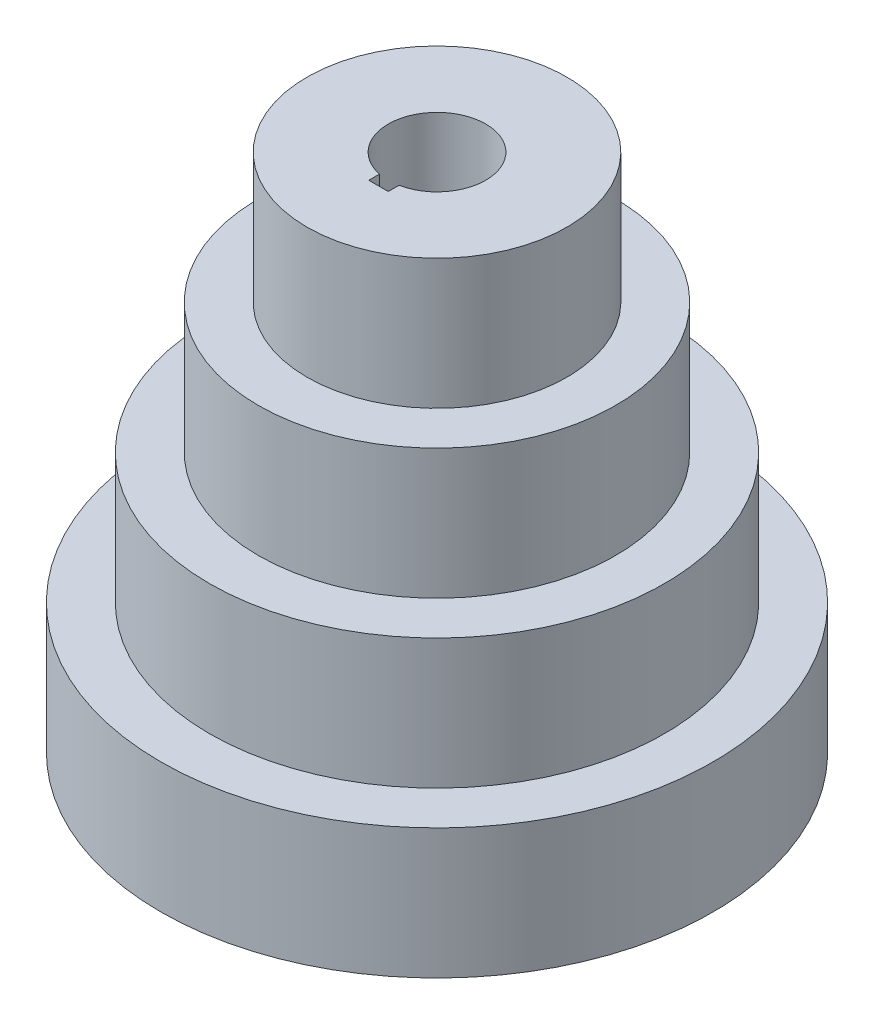
ISO-10303-21;
HEADER;
FILE_DESCRIPTION(('STEP AP214'),'2;1');
FILE_NAME('part.step','',(''),(''),'','','');
FILE_SCHEMA(('AUTOMOTIVE_DESIGN { 1 0 10303 214 1 1 1 1 }'));
ENDSEC;
DATA;
#1=APPLICATION_CONTEXT('core data for automotive mechanical design processes');
#2=APPLICATION_PROTOCOL_DEFINITION('international standard','automotive_design',2000,#1);
#3=PRODUCT_CONTEXT('',#1,'mechanical');
#4=PRODUCT('Part','Part','',(#3));
#5=PRODUCT_RELATED_PRODUCT_CATEGORY('part','',(#4));
#6=PRODUCT_DEFINITION_FORMATION('','',#4);
#7=PRODUCT_DEFINITION_CONTEXT('part definition',#1,'design');
#8=PRODUCT_DEFINITION('design','',#6,#7);
#9=PRODUCT_DEFINITION_SHAPE('','',#8);
#10=(LENGTH_UNIT() NAMED_UNIT(*) SI_UNIT(.MILLI.,.METRE.));
#11=(NAMED_UNIT(*) PLANE_ANGLE_UNIT() SI_UNIT($,.RADIAN.));
#12=(NAMED_UNIT(*) SI_UNIT($,.STERADIAN.) SOLID_ANGLE_UNIT());
#13=UNCERTAINTY_MEASURE_WITH_UNIT(LENGTH_MEASURE(1.E-05),#10,'distance_accuracy_value','');
#14=(GEOMETRIC_REPRESENTATION_CONTEXT(3) GLOBAL_UNCERTAINTY_ASSIGNED_CONTEXT((#13)) GLOBAL_UNIT_ASSIGNED_CONTEXT((#10,
#11,#12)) REPRESENTATION_CONTEXT('',''));
#15=CARTESIAN_POINT('',(0.,0.,0.));
#16=DIRECTION('',(0.,0.,1.));
#17=DIRECTION('',(1.,0.,0.));
#18=AXIS2_PLACEMENT_3D('',#15,#16,#17);
#19=CARTESIAN_POINT('',(0.,0.,0.));
#20=DIRECTION('',(0.,1.,0.));
#21=DIRECTION('',(0.,0.,1.));
#22=AXIS2_PLACEMENT_3D('',#19,#20,#21);
#23=PLANE('',#22);
#24=DIRECTION('',(0.,0.,-1.));
#25=VECTOR('',#24,1.);
#26=CARTESIAN_POINT('',(3.,0.,18.));
#27=LINE('',#26,#25);
#28=CARTESIAN_POINT('',(3.,0.,18.));
#29=VERTEX_POINT('',#28);
#30=CARTESIAN_POINT('',(3.,0.,14.6969384566991));
#31=VERTEX_POINT('',#30);
#32=EDGE_CURVE('E239',#29,#31,#27,.T.);
#33=ORIENTED_EDGE('',*,*,#32,.T.);
#34=CARTESIAN_POINT('',(0.,0.,0.));
#35=DIRECTION('',(0.,1.,0.));
#36=DIRECTION('',(0.,0.,1.));
#37=AXIS2_PLACEMENT_3D('',#34,#35,#36);
#38=CIRCLE('',#37,15.);
#39=CARTESIAN_POINT('',(-3.,0.,14.6969384566991));
#40=VERTEX_POINT('',#39);
#41=EDGE_CURVE('E224',#31,#40,#38,.T.);
#42=ORIENTED_EDGE('',*,*,#41,.T.);
#43=DIRECTION('',(0.,0.,-1.));
#44=VECTOR('',#43,1.);
#45=CARTESIAN_POINT('',(-3.,0.,18.));
#46=LINE('',#45,#44);
#47=CARTESIAN_POINT('',(-3.,0.,18.));
#48=VERTEX_POINT('',#47);
#49=EDGE_CURVE('E236',#48,#40,#46,.T.);
#50=ORIENTED_EDGE('',*,*,#49,.F.);
#51=DIRECTION('',(1.,0.,0.));
#52=VECTOR('',#51,1.);
#53=CARTESIAN_POINT('',(-3.,0.,18.));
#54=LINE('',#53,#52);
#55=EDGE_CURVE('E90',#48,#29,#54,.T.);
#56=ORIENTED_EDGE('',*,*,#55,.T.);
#57=EDGE_LOOP('',(#33,#42,#50,#56));
#58=FACE_BOUND('',#57,.T.);
#59=DIRECTION('',(0.,0.,-1.));
#60=VECTOR('',#59,1.);
#61=CARTESIAN_POINT('',(13.,0.,0.));
#62=LINE('',#61,#60);
#63=CARTESIAN_POINT('',(13.,0.,28.));
#64=VERTEX_POINT('',#63);
#65=CARTESIAN_POINT('',(13.,0.,21.3541565040626));
#66=VERTEX_POINT('',#65);
#67=EDGE_CURVE('E199',#64,#66,#62,.T.);
#68=ORIENTED_EDGE('',*,*,#67,.F.);
#69=DIRECTION('',(1.,0.,0.));
#70=VECTOR('',#69,1.);
#71=CARTESIAN_POINT('',(0.,0.,28.));
#72=LINE('',#71,#70);
#73=CARTESIAN_POINT('',(-13.,0.,28.));
#74=VERTEX_POINT('',#73);
#75=EDGE_CURVE('E191',#74,#64,#72,.T.);
#76=ORIENTED_EDGE('',*,*,#75,.F.);
#77=DIRECTION('',(0.,0.,-1.));
#78=VECTOR('',#77,1.);
#79=CARTESIAN_POINT('',(-13.,0.,0.));
#80=LINE('',#79,#78);
#81=CARTESIAN_POINT('',(-13.,0.,21.3541565040626));
#82=VERTEX_POINT('',#81);
#83=EDGE_CURVE('E82',#74,#82,#80,.T.);
#84=ORIENTED_EDGE('',*,*,#83,.T.);
#85=CARTESIAN_POINT('',(0.,0.,0.));
#86=DIRECTION('',(0.,1.,0.));
#87=DIRECTION('',(0.,0.,1.));
#88=AXIS2_PLACEMENT_3D('',#85,#86,#87);
#89=CIRCLE('',#88,25.);
#90=EDGE_CURVE('E174',#66,#82,#89,.T.);
#91=ORIENTED_EDGE('',*,*,#90,.F.);
#92=EDGE_LOOP('',(#68,#76,#84,#91));
#93=FACE_BOUND('',#92,.T.);
#94=ADVANCED_FACE('F65',(#58,#93),#23,.F.);
#95=CARTESIAN_POINT('',(0.,40.,0.));
#96=DIRECTION('',(0.,-1.,0.));
#97=DIRECTION('',(0.,0.,-1.));
#98=AXIS2_PLACEMENT_3D('',#95,#96,#97);
#99=CYLINDRICAL_SURFACE('',#98,85.);
#100=CARTESIAN_POINT('',(0.,40.,0.));
#101=DIRECTION('',(0.,1.,0.));
#102=DIRECTION('',(0.,0.,1.));
#103=AXIS2_PLACEMENT_3D('',#100,#101,#102);
#104=CIRCLE('',#103,85.);
#105=CARTESIAN_POINT('',(0.,40.,85.));
#106=VERTEX_POINT('',#105);
#107=EDGE_CURVE('E266',#106,#106,#104,.T.);
#108=ORIENTED_EDGE('',*,*,#107,.F.);
#109=EDGE_LOOP('',(#108));
#110=FACE_BOUND('',#109,.T.);
#111=CARTESIAN_POINT('',(0.,0.,0.));
#112=DIRECTION('',(0.,1.,0.));
#113=DIRECTION('',(0.,0.,1.));
#114=AXIS2_PLACEMENT_3D('',#111,#112,#113);
#115=CIRCLE('',#114,85.);
#116=CARTESIAN_POINT('',(0.,0.,85.));
#117=VERTEX_POINT('',#116);
#118=EDGE_CURVE('E69',#117,#117,#115,.T.);
#119=ORIENTED_EDGE('',*,*,#118,.T.);
#120=EDGE_LOOP('',(#119));
#121=FACE_BOUND('',#120,.T.);
#122=ADVANCED_FACE('F67',(#110,#121),#99,.T.);
#123=CARTESIAN_POINT('',(0.,40.,0.));
#124=DIRECTION('',(0.,1.,0.));
#125=DIRECTION('',(0.,0.,1.));
#126=AXIS2_PLACEMENT_3D('',#123,#124,#125);
#127=PLANE('',#126);
#128=CARTESIAN_POINT('',(0.,40.,0.));
#129=DIRECTION('',(0.,1.,0.));
#130=DIRECTION('',(0.,0.,1.));
#131=AXIS2_PLACEMENT_3D('',#128,#129,#130);
#132=CIRCLE('',#131,70.);
#133=CARTESIAN_POINT('',(0.,40.,70.));
#134=VERTEX_POINT('',#133);
#135=EDGE_CURVE('E262',#134,#134,#132,.T.);
#136=ORIENTED_EDGE('',*,*,#135,.F.);
#137=EDGE_LOOP('',(#136));
#138=FACE_BOUND('',#137,.T.);
#139=ORIENTED_EDGE('',*,*,#107,.T.);
#140=EDGE_LOOP('',(#139));
#141=FACE_BOUND('',#140,.T.);
#142=ADVANCED_FACE('F277',(#138,#141),#127,.T.);
#143=CARTESIAN_POINT('',(0.,0.,0.));
#144=DIRECTION('',(0.,1.,0.));
#145=DIRECTION('',(0.,0.,1.));
#146=AXIS2_PLACEMENT_3D('',#143,#144,#145);
#147=CIRCLE('',#146,75.);
#148=CARTESIAN_POINT('',(0.,0.,75.));
#149=VERTEX_POINT('',#148);
#150=EDGE_CURVE('E192',#149,#149,#147,.T.);
#151=ORIENTED_EDGE('',*,*,#150,.T.);
#152=EDGE_LOOP('',(#151));
#153=FACE_BOUND('',#152,.T.);
#154=ORIENTED_EDGE('',*,*,#118,.F.);
#155=EDGE_LOOP('',(#154));
#156=FACE_BOUND('',#155,.T.);
#157=ADVANCED_FACE('F274',(#153,#156),#23,.F.);
#158=CARTESIAN_POINT('',(0.,80.,0.));
#159=DIRECTION('',(0.,-1.,0.));
#160=DIRECTION('',(0.,0.,-1.));
#161=AXIS2_PLACEMENT_3D('',#158,#159,#160);
#162=CYLINDRICAL_SURFACE('',#161,70.);
#163=CARTESIAN_POINT('',(0.,80.,0.));
#164=DIRECTION('',(0.,1.,0.));
#165=DIRECTION('',(0.,0.,1.));
#166=AXIS2_PLACEMENT_3D('',#163,#164,#165);
#167=CIRCLE('',#166,70.);
#168=CARTESIAN_POINT('',(0.,80.,70.));
#169=VERTEX_POINT('',#168);
#170=EDGE_CURVE('E259',#169,#169,#167,.T.);
#171=ORIENTED_EDGE('',*,*,#170,.F.);
#172=EDGE_LOOP('',(#171));
#173=FACE_BOUND('',#172,.T.);
#174=ORIENTED_EDGE('',*,*,#135,.T.);
#175=EDGE_LOOP('',(#174));
#176=FACE_BOUND('',#175,.T.);
#177=ADVANCED_FACE('F276',(#173,#176),#162,.T.);
#178=CARTESIAN_POINT('',(0.,80.,0.));
#179=DIRECTION('',(0.,1.,0.));
#180=DIRECTION('',(0.,0.,1.));
#181=AXIS2_PLACEMENT_3D('',#178,#179,#180);
#182=PLANE('',#181);
#183=CARTESIAN_POINT('',(0.,80.,0.));
#184=DIRECTION('',(0.,1.,0.));
#185=DIRECTION('',(0.,0.,1.));
#186=AXIS2_PLACEMENT_3D('',#183,#184,#185);
#187=CIRCLE('',#186,55.);
#188=CARTESIAN_POINT('',(0.,80.,55.));
#189=VERTEX_POINT('',#188);
#190=EDGE_CURVE('E74',#189,#189,#187,.T.);
#191=ORIENTED_EDGE('',*,*,#190,.F.);
#192=EDGE_LOOP('',(#191));
#193=FACE_BOUND('',#192,.T.);
#194=ORIENTED_EDGE('',*,*,#170,.T.);
#195=EDGE_LOOP('',(#194));
#196=FACE_BOUND('',#195,.T.);
#197=ADVANCED_FACE('F283',(#193,#196),#182,.T.);
#198=CARTESIAN_POINT('',(0.,120.,0.));
#199=DIRECTION('',(0.,-1.,0.));
#200=DIRECTION('',(0.,0.,-1.));
#201=AXIS2_PLACEMENT_3D('',#198,#199,#200);
#202=CYLINDRICAL_SURFACE('',#201,55.);
#203=CARTESIAN_POINT('',(0.,120.,0.));
#204=DIRECTION('',(0.,1.,0.));
#205=DIRECTION('',(0.,0.,1.));
#206=AXIS2_PLACEMENT_3D('',#203,#204,#205);
#207=CIRCLE('',#206,55.);
#208=CARTESIAN_POINT('',(0.,120.,55.));
#209=VERTEX_POINT('',#208);
#210=EDGE_CURVE('E255',#209,#209,#207,.T.);
#211=ORIENTED_EDGE('',*,*,#210,.F.);
#212=EDGE_LOOP('',(#211));
#213=FACE_BOUND('',#212,.T.);
#214=ORIENTED_EDGE('',*,*,#190,.T.);
#215=EDGE_LOOP('',(#214));
#216=FACE_BOUND('',#215,.T.);
#217=ADVANCED_FACE('F407',(#213,#216),#202,.T.);
#218=CARTESIAN_POINT('',(0.,120.,0.));
#219=DIRECTION('',(0.,1.,0.));
#220=DIRECTION('',(0.,0.,1.));
#221=AXIS2_PLACEMENT_3D('',#218,#219,#220);
#222=PLANE('',#221);
#223=CARTESIAN_POINT('',(0.,120.,0.));
#224=DIRECTION('',(0.,1.,0.));
#225=DIRECTION('',(0.,0.,1.));
#226=AXIS2_PLACEMENT_3D('',#223,#224,#225);
#227=CIRCLE('',#226,40.);
#228=CARTESIAN_POINT('',(0.,120.,40.));
#229=VERTEX_POINT('',#228);
#230=EDGE_CURVE('E12',#229,#229,#227,.T.);
#231=ORIENTED_EDGE('',*,*,#230,.F.);
#232=EDGE_LOOP('',(#231));
#233=FACE_BOUND('',#232,.T.);
#234=ORIENTED_EDGE('',*,*,#210,.T.);
#235=EDGE_LOOP('',(#234));
#236=FACE_BOUND('',#235,.T.);
#237=ADVANCED_FACE('F403',(#233,#236),#222,.T.);
#238=CARTESIAN_POINT('',(0.,160.,0.));
#239=DIRECTION('',(0.,-1.,0.));
#240=DIRECTION('',(0.,0.,-1.));
#241=AXIS2_PLACEMENT_3D('',#238,#239,#240);
#242=CYLINDRICAL_SURFACE('',#241,40.);
#243=CARTESIAN_POINT('',(0.,160.,0.));
#244=DIRECTION('',(0.,1.,0.));
#245=DIRECTION('',(0.,0.,1.));
#246=AXIS2_PLACEMENT_3D('',#243,#244,#245);
#247=CIRCLE('',#246,40.);
#248=CARTESIAN_POINT('',(0.,160.,40.));
#249=VERTEX_POINT('',#248);
#250=EDGE_CURVE('E234',#249,#249,#247,.T.);
#251=ORIENTED_EDGE('',*,*,#250,.F.);
#252=EDGE_LOOP('',(#251));
#253=FACE_BOUND('',#252,.T.);
#254=ORIENTED_EDGE('',*,*,#230,.T.);
#255=EDGE_LOOP('',(#254));
#256=FACE_BOUND('',#255,.T.);
#257=ADVANCED_FACE('F399',(#253,#256),#242,.T.);
#258=CARTESIAN_POINT('',(0.,160.,0.));
#259=DIRECTION('',(0.,1.,0.));
#260=DIRECTION('',(0.,0.,1.));
#261=AXIS2_PLACEMENT_3D('',#258,#259,#260);
#262=PLANE('',#261);
#263=CARTESIAN_POINT('',(0.,160.,0.));
#264=DIRECTION('',(0.,1.,0.));
#265=DIRECTION('',(0.,0.,1.));
#266=AXIS2_PLACEMENT_3D('',#263,#264,#265);
#267=CIRCLE('',#266,15.);
#268=CARTESIAN_POINT('',(3.,160.,14.6969384566991));
#269=VERTEX_POINT('',#268);
#270=CARTESIAN_POINT('',(-3.,160.,14.6969384566991));
#271=VERTEX_POINT('',#270);
#272=EDGE_CURVE('E228',#269,#271,#267,.T.);
#273=ORIENTED_EDGE('',*,*,#272,.F.);
#274=DIRECTION('',(0.,0.,-1.));
#275=VECTOR('',#274,1.);
#276=CARTESIAN_POINT('',(3.,160.,18.));
#277=LINE('',#276,#275);
#278=CARTESIAN_POINT('',(3.,160.,18.));
#279=VERTEX_POINT('',#278);
#280=EDGE_CURVE('E247',#279,#269,#277,.T.);
#281=ORIENTED_EDGE('',*,*,#280,.F.);
#282=DIRECTION('',(1.,0.,0.));
#283=VECTOR('',#282,1.);
#284=CARTESIAN_POINT('',(-3.,160.,18.));
#285=LINE('',#284,#283);
#286=CARTESIAN_POINT('',(-3.,160.,18.));
#287=VERTEX_POINT('',#286);
#288=EDGE_CURVE('E240',#287,#279,#285,.T.);
#289=ORIENTED_EDGE('',*,*,#288,.F.);
#290=DIRECTION('',(0.,0.,-1.));
#291=VECTOR('',#290,1.);
#292=CARTESIAN_POINT('',(-3.,160.,18.));
#293=LINE('',#292,#291);
#294=EDGE_CURVE('E223',#287,#271,#293,.T.);
#295=ORIENTED_EDGE('',*,*,#294,.T.);
#296=EDGE_LOOP('',(#273,#281,#289,#295));
#297=FACE_BOUND('',#296,.T.);
#298=ORIENTED_EDGE('',*,*,#250,.T.);
#299=EDGE_LOOP('',(#298));
#300=FACE_BOUND('',#299,.T.);
#301=ADVANCED_FACE('F386',(#297,#300),#262,.T.);
#302=CARTESIAN_POINT('',(0.,0.,0.));
#303=DIRECTION('',(0.,1.,0.));
#304=DIRECTION('',(0.,0.,1.));
#305=AXIS2_PLACEMENT_3D('',#302,#303,#304);
#306=CYLINDRICAL_SURFACE('',#305,15.);
#307=ORIENTED_EDGE('',*,*,#272,.T.);
#308=DIRECTION('',(0.,1.,0.));
#309=VECTOR('',#308,1.);
#310=CARTESIAN_POINT('',(-3.,0.,14.6969384566991));
#311=LINE('',#310,#309);
#312=EDGE_CURVE('E231',#40,#271,#311,.T.);
#313=ORIENTED_EDGE('',*,*,#312,.F.);
#314=ORIENTED_EDGE('',*,*,#41,.F.);
#315=DIRECTION('',(0.,1.,0.));
#316=VECTOR('',#315,1.);
#317=CARTESIAN_POINT('',(3.,0.,14.6969384566991));
#318=LINE('',#317,#316);
#319=EDGE_CURVE('E227',#31,#269,#318,.T.);
#320=ORIENTED_EDGE('',*,*,#319,.T.);
#321=EDGE_LOOP('',(#307,#313,#314,#320));
#322=FACE_BOUND('',#321,.T.);
#323=ADVANCED_FACE('F369',(#322),#306,.F.);
#324=CARTESIAN_POINT('',(3.,0.,18.));
#325=DIRECTION('',(1.,0.,0.));
#326=DIRECTION('',(0.,0.,-1.));
#327=AXIS2_PLACEMENT_3D('',#324,#325,#326);
#328=PLANE('',#327);
#329=ORIENTED_EDGE('',*,*,#32,.F.);
#330=DIRECTION('',(0.,1.,0.));
#331=VECTOR('',#330,1.);
#332=CARTESIAN_POINT('',(3.,0.,18.));
#333=LINE('',#332,#331);
#334=EDGE_CURVE('E230',#29,#279,#333,.T.);
#335=ORIENTED_EDGE('',*,*,#334,.T.);
#336=ORIENTED_EDGE('',*,*,#280,.T.);
#337=ORIENTED_EDGE('',*,*,#319,.F.);
#338=EDGE_LOOP('',(#329,#335,#336,#337));
#339=FACE_BOUND('',#338,.T.);
#340=ADVANCED_FACE('F385',(#339),#328,.F.);
#341=CARTESIAN_POINT('',(-3.,0.,18.));
#342=DIRECTION('',(0.,0.,1.));
#343=DIRECTION('',(1.,0.,0.));
#344=AXIS2_PLACEMENT_3D('',#341,#342,#343);
#345=PLANE('',#344);
#346=ORIENTED_EDGE('',*,*,#288,.T.);
#347=ORIENTED_EDGE('',*,*,#334,.F.);
#348=ORIENTED_EDGE('',*,*,#55,.F.);
#349=DIRECTION('',(0.,1.,0.));
#350=VECTOR('',#349,1.);
#351=CARTESIAN_POINT('',(-3.,0.,18.));
#352=LINE('',#351,#350);
#353=EDGE_CURVE('E244',#48,#287,#352,.T.);
#354=ORIENTED_EDGE('',*,*,#353,.T.);
#355=EDGE_LOOP('',(#346,#347,#348,#354));
#356=FACE_BOUND('',#355,.T.);
#357=ADVANCED_FACE('F388',(#356),#345,.F.);
#358=CARTESIAN_POINT('',(-3.,0.,18.));
#359=DIRECTION('',(1.,0.,0.));
#360=DIRECTION('',(0.,0.,-1.));
#361=AXIS2_PLACEMENT_3D('',#358,#359,#360);
#362=PLANE('',#361);
#363=ORIENTED_EDGE('',*,*,#312,.T.);
#364=ORIENTED_EDGE('',*,*,#294,.F.);
#365=ORIENTED_EDGE('',*,*,#353,.F.);
#366=ORIENTED_EDGE('',*,*,#49,.T.);
#367=EDGE_LOOP('',(#363,#364,#365,#366));
#368=FACE_BOUND('',#367,.T.);
#369=ADVANCED_FACE('F367',(#368),#362,.T.);
#370=CARTESIAN_POINT('',(0.,110.,0.));
#371=DIRECTION('',(0.,1.,0.));
#372=DIRECTION('',(0.,0.,1.));
#373=AXIS2_PLACEMENT_3D('',#370,#371,#372);
#374=PLANE('',#373);
#375=CARTESIAN_POINT('',(0.,110.,0.));
#376=DIRECTION('',(0.,1.,0.));
#377=DIRECTION('',(0.,0.,1.));
#378=AXIS2_PLACEMENT_3D('',#375,#376,#377);
#379=CIRCLE('',#378,45.);
#380=CARTESIAN_POINT('',(0.,110.,45.));
#381=VERTEX_POINT('',#380);
#382=EDGE_CURVE('E314',#381,#381,#379,.T.);
#383=ORIENTED_EDGE('',*,*,#382,.F.);
#384=EDGE_LOOP('',(#383));
#385=FACE_BOUND('',#384,.T.);
#386=DIRECTION('',(0.,0.,1.));
#387=VECTOR('',#386,1.);
#388=CARTESIAN_POINT('',(-13.,110.,18.));
#389=LINE('',#388,#387);
#390=CARTESIAN_POINT('',(-13.,110.,27.0370116691915));
#391=VERTEX_POINT('',#390);
#392=CARTESIAN_POINT('',(-13.,110.,28.));
#393=VERTEX_POINT('',#392);
#394=EDGE_CURVE('E221',#391,#393,#389,.T.);
#395=ORIENTED_EDGE('',*,*,#394,.T.);
#396=DIRECTION('',(1.,0.,0.));
#397=VECTOR('',#396,1.);
#398=CARTESIAN_POINT('',(0.,110.,28.));
#399=LINE('',#398,#397);
#400=CARTESIAN_POINT('',(-10.770329614269,110.,28.));
#401=VERTEX_POINT('',#400);
#402=EDGE_CURVE('E220',#393,#401,#399,.T.);
#403=ORIENTED_EDGE('',*,*,#402,.T.);
#404=CARTESIAN_POINT('',(0.,110.,0.));
#405=DIRECTION('',(0.,1.,0.));
#406=DIRECTION('',(0.,0.,1.));
#407=AXIS2_PLACEMENT_3D('',#404,#405,#406);
#408=CIRCLE('',#407,30.);
#409=CARTESIAN_POINT('',(10.770329614269,110.,28.));
#410=VERTEX_POINT('',#409);
#411=EDGE_CURVE('E309',#401,#410,#408,.T.);
#412=ORIENTED_EDGE('',*,*,#411,.T.);
#413=CARTESIAN_POINT('',(13.,110.,28.));
#414=VERTEX_POINT('',#413);
#415=EDGE_CURVE('E217',#410,#414,#399,.T.);
#416=ORIENTED_EDGE('',*,*,#415,.T.);
#417=DIRECTION('',(0.,0.,1.));
#418=VECTOR('',#417,1.);
#419=CARTESIAN_POINT('',(13.,110.,18.));
#420=LINE('',#419,#418);
#421=CARTESIAN_POINT('',(13.,110.,27.0370116691915));
#422=VERTEX_POINT('',#421);
#423=EDGE_CURVE('E215',#422,#414,#420,.T.);
#424=ORIENTED_EDGE('',*,*,#423,.F.);
#425=EDGE_CURVE('E209',#422,#391,#408,.T.);
#426=ORIENTED_EDGE('',*,*,#425,.T.);
#427=EDGE_LOOP('',(#395,#403,#412,#416,#424,#426));
#428=FACE_BOUND('',#427,.T.);
#429=ADVANCED_FACE('F307',(#385,#428),#374,.F.);
#430=CARTESIAN_POINT('',(13.,0.,18.));
#431=DIRECTION('',(1.,0.,0.));
#432=DIRECTION('',(0.,0.,-1.));
#433=AXIS2_PLACEMENT_3D('',#430,#431,#432);
#434=PLANE('',#433);
#435=ORIENTED_EDGE('',*,*,#423,.T.);
#436=DIRECTION('',(0.,1.,0.));
#437=VECTOR('',#436,1.);
#438=CARTESIAN_POINT('',(13.,0.,28.));
#439=LINE('',#438,#437);
#440=EDGE_CURVE('E175',#64,#414,#439,.T.);
#441=ORIENTED_EDGE('',*,*,#440,.F.);
#442=ORIENTED_EDGE('',*,*,#67,.T.);
#443=DIRECTION('',(0.,1.,0.));
#444=VECTOR('',#443,1.);
#445=CARTESIAN_POINT('',(13.,0.,21.3541565040626));
#446=LINE('',#445,#444);
#447=CARTESIAN_POINT('',(13.,150.,21.3541565040626));
#448=VERTEX_POINT('',#447);
#449=EDGE_CURVE('E180',#66,#448,#446,.T.);
#450=ORIENTED_EDGE('',*,*,#449,.T.);
#451=DIRECTION('',(0.,0.,-1.));
#452=VECTOR('',#451,1.);
#453=CARTESIAN_POINT('',(13.,150.,0.));
#454=LINE('',#453,#452);
#455=CARTESIAN_POINT('',(13.,150.,27.0370116691915));
#456=VERTEX_POINT('',#455);
#457=EDGE_CURVE('E166',#456,#448,#454,.T.);
#458=ORIENTED_EDGE('',*,*,#457,.F.);
#459=DIRECTION('',(0.,-1.,0.));
#460=VECTOR('',#459,1.);
#461=CARTESIAN_POINT('',(13.,160.,27.0370116691915));
#462=LINE('',#461,#460);
#463=EDGE_CURVE('E205',#456,#422,#462,.T.);
#464=ORIENTED_EDGE('',*,*,#463,.T.);
#465=EDGE_LOOP('',(#435,#441,#442,#450,#458,#464));
#466=FACE_BOUND('',#465,.T.);
#467=ADVANCED_FACE('F299',(#466),#434,.T.);
#468=CARTESIAN_POINT('',(0.,160.,0.));
#469=DIRECTION('',(0.,-1.,0.));
#470=DIRECTION('',(0.,0.,-1.));
#471=AXIS2_PLACEMENT_3D('',#468,#469,#470);
#472=CYLINDRICAL_SURFACE('',#471,30.);
#473=ORIENTED_EDGE('',*,*,#425,.F.);
#474=ORIENTED_EDGE('',*,*,#463,.F.);
#475=CARTESIAN_POINT('',(0.,150.,0.));
#476=DIRECTION('',(0.,1.,0.));
#477=DIRECTION('',(0.,0.,1.));
#478=AXIS2_PLACEMENT_3D('',#475,#476,#477);
#479=CIRCLE('',#478,30.);
#480=CARTESIAN_POINT('',(-13.,150.,27.0370116691915));
#481=VERTEX_POINT('',#480);
#482=EDGE_CURVE('E179',#456,#481,#479,.T.);
#483=ORIENTED_EDGE('',*,*,#482,.T.);
#484=DIRECTION('',(0.,-1.,0.));
#485=VECTOR('',#484,1.);
#486=CARTESIAN_POINT('',(-13.,160.,27.0370116691915));
#487=LINE('',#486,#485);
#488=EDGE_CURVE('E162',#391,#481,#487,.F.);
#489=ORIENTED_EDGE('',*,*,#488,.F.);
#490=EDGE_LOOP('',(#473,#474,#483,#489));
#491=FACE_BOUND('',#490,.T.);
#492=ADVANCED_FACE('F372',(#491),#472,.F.);
#493=CARTESIAN_POINT('',(0.,150.,0.));
#494=DIRECTION('',(0.,1.,0.));
#495=DIRECTION('',(0.,0.,1.));
#496=AXIS2_PLACEMENT_3D('',#493,#494,#495);
#497=PLANE('',#496);
#498=ORIENTED_EDGE('',*,*,#457,.T.);
#499=CARTESIAN_POINT('',(0.,150.,0.));
#500=DIRECTION('',(0.,1.,0.));
#501=DIRECTION('',(0.,0.,1.));
#502=AXIS2_PLACEMENT_3D('',#499,#500,#501);
#503=CIRCLE('',#502,25.);
#504=CARTESIAN_POINT('',(-13.,150.,21.3541565040626));
#505=VERTEX_POINT('',#504);
#506=EDGE_CURVE('E170',#448,#505,#503,.T.);
#507=ORIENTED_EDGE('',*,*,#506,.T.);
#508=DIRECTION('',(0.,0.,-1.));
#509=VECTOR('',#508,1.);
#510=CARTESIAN_POINT('',(-13.,150.,0.));
#511=LINE('',#510,#509);
#512=EDGE_CURVE('E155',#481,#505,#511,.T.);
#513=ORIENTED_EDGE('',*,*,#512,.F.);
#514=ORIENTED_EDGE('',*,*,#482,.F.);
#515=EDGE_LOOP('',(#498,#507,#513,#514));
#516=FACE_BOUND('',#515,.T.);
#517=ADVANCED_FACE('F171',(#516),#497,.F.);
#518=CARTESIAN_POINT('',(0.,40.,0.));
#519=DIRECTION('',(0.,-1.,0.));
#520=DIRECTION('',(0.,0.,-1.));
#521=AXIS2_PLACEMENT_3D('',#518,#519,#520);
#522=CYLINDRICAL_SURFACE('',#521,75.);
#523=CARTESIAN_POINT('',(0.,30.,0.));
#524=DIRECTION('',(0.,1.,0.));
#525=DIRECTION('',(0.,0.,1.));
#526=AXIS2_PLACEMENT_3D('',#523,#524,#525);
#527=CIRCLE('',#526,75.);
#528=CARTESIAN_POINT('',(0.,30.,75.));
#529=VERTEX_POINT('',#528);
#530=EDGE_CURVE('E195',#529,#529,#527,.T.);
#531=ORIENTED_EDGE('',*,*,#530,.T.);
#532=EDGE_LOOP('',(#531));
#533=FACE_BOUND('',#532,.T.);
#534=ORIENTED_EDGE('',*,*,#150,.F.);
#535=EDGE_LOOP('',(#534));
#536=FACE_BOUND('',#535,.T.);
#537=ADVANCED_FACE('F345',(#533,#536),#522,.F.);
#538=CARTESIAN_POINT('',(0.,30.,0.));
#539=DIRECTION('',(0.,1.,0.));
#540=DIRECTION('',(0.,0.,1.));
#541=AXIS2_PLACEMENT_3D('',#538,#539,#540);
#542=PLANE('',#541);
#543=CARTESIAN_POINT('',(0.,30.,0.));
#544=DIRECTION('',(0.,1.,0.));
#545=DIRECTION('',(0.,0.,1.));
#546=AXIS2_PLACEMENT_3D('',#543,#544,#545);
#547=CIRCLE('',#546,60.);
#548=CARTESIAN_POINT('',(0.,30.,60.));
#549=VERTEX_POINT('',#548);
#550=EDGE_CURVE('E334',#549,#549,#547,.T.);
#551=ORIENTED_EDGE('',*,*,#550,.T.);
#552=EDGE_LOOP('',(#551));
#553=FACE_BOUND('',#552,.T.);
#554=ORIENTED_EDGE('',*,*,#530,.F.);
#555=EDGE_LOOP('',(#554));
#556=FACE_BOUND('',#555,.T.);
#557=ADVANCED_FACE('F348',(#553,#556),#542,.F.);
#558=CARTESIAN_POINT('',(0.,80.,0.));
#559=DIRECTION('',(0.,-1.,0.));
#560=DIRECTION('',(0.,0.,-1.));
#561=AXIS2_PLACEMENT_3D('',#558,#559,#560);
#562=CYLINDRICAL_SURFACE('',#561,60.);
#563=CARTESIAN_POINT('',(0.,70.,0.));
#564=DIRECTION('',(0.,1.,0.));
#565=DIRECTION('',(0.,0.,1.));
#566=AXIS2_PLACEMENT_3D('',#563,#564,#565);
#567=CIRCLE('',#566,60.);
#568=CARTESIAN_POINT('',(0.,70.,60.));
#569=VERTEX_POINT('',#568);
#570=EDGE_CURVE('E196',#569,#569,#567,.T.);
#571=ORIENTED_EDGE('',*,*,#570,.T.);
#572=EDGE_LOOP('',(#571));
#573=FACE_BOUND('',#572,.T.);
#574=ORIENTED_EDGE('',*,*,#550,.F.);
#575=EDGE_LOOP('',(#574));
#576=FACE_BOUND('',#575,.T.);
#577=ADVANCED_FACE('F350',(#573,#576),#562,.F.);
#578=CARTESIAN_POINT('',(0.,70.,0.));
#579=DIRECTION('',(0.,1.,0.));
#580=DIRECTION('',(0.,0.,1.));
#581=AXIS2_PLACEMENT_3D('',#578,#579,#580);
#582=PLANE('',#581);
#583=CARTESIAN_POINT('',(0.,70.,0.));
#584=DIRECTION('',(0.,1.,0.));
#585=DIRECTION('',(0.,0.,1.));
#586=AXIS2_PLACEMENT_3D('',#583,#584,#585);
#587=CIRCLE('',#586,45.);
#588=CARTESIAN_POINT('',(0.,70.,45.));
#589=VERTEX_POINT('',#588);
#590=EDGE_CURVE('E312',#589,#589,#587,.T.);
#591=ORIENTED_EDGE('',*,*,#590,.T.);
#592=EDGE_LOOP('',(#591));
#593=FACE_BOUND('',#592,.T.);
#594=ORIENTED_EDGE('',*,*,#570,.F.);
#595=EDGE_LOOP('',(#594));
#596=FACE_BOUND('',#595,.T.);
#597=ADVANCED_FACE('F356',(#593,#596),#582,.F.);
#598=CARTESIAN_POINT('',(0.,120.,0.));
#599=DIRECTION('',(0.,-1.,0.));
#600=DIRECTION('',(0.,0.,-1.));
#601=AXIS2_PLACEMENT_3D('',#598,#599,#600);
#602=CYLINDRICAL_SURFACE('',#601,45.);
#603=ORIENTED_EDGE('',*,*,#382,.T.);
#604=EDGE_LOOP('',(#603));
#605=FACE_BOUND('',#604,.T.);
#606=ORIENTED_EDGE('',*,*,#590,.F.);
#607=EDGE_LOOP('',(#606));
#608=FACE_BOUND('',#607,.T.);
#609=ADVANCED_FACE('F362',(#605,#608),#602,.F.);
#610=CARTESIAN_POINT('',(-10.770329614269,150.,28.));
#611=VERTEX_POINT('',#610);
#612=CARTESIAN_POINT('',(10.770329614269,150.,28.));
#613=VERTEX_POINT('',#612);
#614=EDGE_CURVE('E182',#611,#613,#479,.T.);
#615=ORIENTED_EDGE('',*,*,#614,.T.);
#616=DIRECTION('',(0.,-1.,0.));
#617=VECTOR('',#616,1.);
#618=CARTESIAN_POINT('',(10.770329614269,160.,28.));
#619=LINE('',#618,#617);
#620=EDGE_CURVE('E208',#613,#410,#619,.T.);
#621=ORIENTED_EDGE('',*,*,#620,.T.);
#622=ORIENTED_EDGE('',*,*,#411,.F.);
#623=DIRECTION('',(0.,-1.,0.));
#624=VECTOR('',#623,1.);
#625=CARTESIAN_POINT('',(-10.770329614269,160.,28.));
#626=LINE('',#625,#624);
#627=EDGE_CURVE('E212',#611,#401,#626,.T.);
#628=ORIENTED_EDGE('',*,*,#627,.F.);
#629=EDGE_LOOP('',(#615,#621,#622,#628));
#630=FACE_BOUND('',#629,.T.);
#631=ADVANCED_FACE('F324',(#630),#472,.F.);
#632=ORIENTED_EDGE('',*,*,#614,.F.);
#633=DIRECTION('',(1.,0.,0.));
#634=VECTOR('',#633,1.);
#635=CARTESIAN_POINT('',(0.,150.,28.));
#636=LINE('',#635,#634);
#637=EDGE_CURVE('E200',#611,#613,#636,.T.);
#638=ORIENTED_EDGE('',*,*,#637,.T.);
#639=EDGE_LOOP('',(#632,#638));
#640=FACE_BOUND('',#639,.T.);
#641=ADVANCED_FACE('F322',(#640),#497,.F.);
#642=CARTESIAN_POINT('',(0.,0.,0.));
#643=DIRECTION('',(0.,1.,0.));
#644=DIRECTION('',(0.,0.,1.));
#645=AXIS2_PLACEMENT_3D('',#642,#643,#644);
#646=CYLINDRICAL_SURFACE('',#645,25.);
#647=ORIENTED_EDGE('',*,*,#506,.F.);
#648=ORIENTED_EDGE('',*,*,#449,.F.);
#649=ORIENTED_EDGE('',*,*,#90,.T.);
#650=DIRECTION('',(0.,1.,0.));
#651=VECTOR('',#650,1.);
#652=CARTESIAN_POINT('',(-13.,0.,21.3541565040626));
#653=LINE('',#652,#651);
#654=EDGE_CURVE('E159',#82,#505,#653,.T.);
#655=ORIENTED_EDGE('',*,*,#654,.T.);
#656=EDGE_LOOP('',(#647,#648,#649,#655));
#657=FACE_BOUND('',#656,.T.);
#658=ADVANCED_FACE('F177',(#657),#646,.T.);
#659=CARTESIAN_POINT('',(-3.,0.,28.));
#660=DIRECTION('',(0.,0.,1.));
#661=DIRECTION('',(1.,0.,0.));
#662=AXIS2_PLACEMENT_3D('',#659,#660,#661);
#663=PLANE('',#662);
#664=DIRECTION('',(0.,1.,0.));
#665=VECTOR('',#664,1.);
#666=CARTESIAN_POINT('',(-13.,0.,28.));
#667=LINE('',#666,#665);
#668=EDGE_CURVE('E189',#74,#393,#667,.T.);
#669=ORIENTED_EDGE('',*,*,#668,.F.);
#670=ORIENTED_EDGE('',*,*,#75,.T.);
#671=ORIENTED_EDGE('',*,*,#440,.T.);
#672=ORIENTED_EDGE('',*,*,#415,.F.);
#673=ORIENTED_EDGE('',*,*,#620,.F.);
#674=ORIENTED_EDGE('',*,*,#637,.F.);
#675=ORIENTED_EDGE('',*,*,#627,.T.);
#676=ORIENTED_EDGE('',*,*,#402,.F.);
#677=EDGE_LOOP('',(#669,#670,#671,#672,#673,#674,#675,#676));
#678=FACE_BOUND('',#677,.T.);
#679=ADVANCED_FACE('F301',(#678),#663,.T.);
#680=CARTESIAN_POINT('',(-13.,0.,18.));
#681=DIRECTION('',(1.,0.,0.));
#682=DIRECTION('',(0.,0.,-1.));
#683=AXIS2_PLACEMENT_3D('',#680,#681,#682);
#684=PLANE('',#683);
#685=ORIENTED_EDGE('',*,*,#488,.T.);
#686=ORIENTED_EDGE('',*,*,#512,.T.);
#687=ORIENTED_EDGE('',*,*,#654,.F.);
#688=ORIENTED_EDGE('',*,*,#83,.F.);
#689=ORIENTED_EDGE('',*,*,#668,.T.);
#690=ORIENTED_EDGE('',*,*,#394,.F.);
#691=EDGE_LOOP('',(#685,#686,#687,#688,#689,#690));
#692=FACE_BOUND('',#691,.T.);
#693=ADVANCED_FACE('F157',(#692),#684,.F.);
#694=CLOSED_SHELL('',(#94,#122,#142,#157,#177,#197,#217,#237,#257,#301,#323,#340,#357,#369,#429,
#467,#492,#517,#537,#557,#577,#597,#609,#631,#641,#658,#679,#693));
#695=MANIFOLD_SOLID_BREP('B2',#694);
#696=ADVANCED_BREP_SHAPE_REPRESENTATION('',(#18,#695),#14);
#697=SHAPE_DEFINITION_REPRESENTATION(#9,#696);
ENDSEC;
END-ISO-10303-21;
